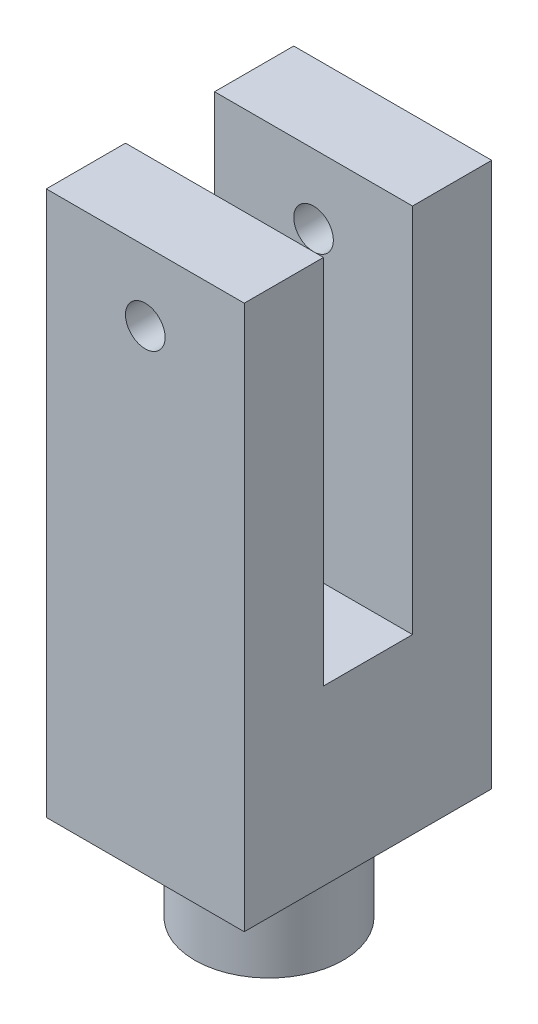
ISO-10303-21;
HEADER;
FILE_DESCRIPTION(('STEP AP214'),'2;1');
FILE_NAME('part.step','',(''),(''),'','','');
FILE_SCHEMA(('AUTOMOTIVE_DESIGN { 1 0 10303 214 1 1 1 1 }'));
ENDSEC;
DATA;
#1=APPLICATION_CONTEXT('core data for automotive mechanical design processes');
#2=APPLICATION_PROTOCOL_DEFINITION('international standard','automotive_design',2000,#1);
#3=PRODUCT_CONTEXT('',#1,'mechanical');
#4=PRODUCT('Part','Part','',(#3));
#5=PRODUCT_RELATED_PRODUCT_CATEGORY('part','',(#4));
#6=PRODUCT_DEFINITION_FORMATION('','',#4);
#7=PRODUCT_DEFINITION_CONTEXT('part definition',#1,'design');
#8=PRODUCT_DEFINITION('design','',#6,#7);
#9=PRODUCT_DEFINITION_SHAPE('','',#8);
#10=(LENGTH_UNIT() NAMED_UNIT(*) SI_UNIT(.MILLI.,.METRE.));
#11=(NAMED_UNIT(*) PLANE_ANGLE_UNIT() SI_UNIT($,.RADIAN.));
#12=(NAMED_UNIT(*) SI_UNIT($,.STERADIAN.) SOLID_ANGLE_UNIT());
#13=UNCERTAINTY_MEASURE_WITH_UNIT(LENGTH_MEASURE(1.E-05),#10,'distance_accuracy_value','');
#14=(GEOMETRIC_REPRESENTATION_CONTEXT(3) GLOBAL_UNCERTAINTY_ASSIGNED_CONTEXT((#13)) GLOBAL_UNIT_ASSIGNED_CONTEXT((#10,
#11,#12)) REPRESENTATION_CONTEXT('',''));
#15=CARTESIAN_POINT('',(0.,0.,0.));
#16=DIRECTION('',(0.,0.,1.));
#17=DIRECTION('',(1.,0.,0.));
#18=AXIS2_PLACEMENT_3D('',#15,#16,#17);
#19=CARTESIAN_POINT('',(0.,130.,0.));
#20=DIRECTION('',(0.,1.,0.));
#21=DIRECTION('',(0.,0.,1.));
#22=AXIS2_PLACEMENT_3D('',#19,#20,#21);
#23=PLANE('',#22);
#24=DIRECTION('',(-1.,0.,0.));
#25=VECTOR('',#24,1.);
#26=CARTESIAN_POINT('',(0.,130.,-9.));
#27=LINE('',#26,#25);
#28=CARTESIAN_POINT('',(20.,130.,-9.));
#29=VERTEX_POINT('',#28);
#30=CARTESIAN_POINT('',(-20.,130.,-8.99999999999999));
#31=VERTEX_POINT('',#30);
#32=EDGE_CURVE('E11',#29,#31,#27,.T.);
#33=ORIENTED_EDGE('',*,*,#32,.F.);
#34=DIRECTION('',(0.,0.,-1.));
#35=VECTOR('',#34,1.);
#36=CARTESIAN_POINT('',(20.,130.,-25.));
#37=LINE('',#36,#35);
#38=CARTESIAN_POINT('',(20.,130.,-25.));
#39=VERTEX_POINT('',#38);
#40=EDGE_CURVE('E87',#29,#39,#37,.T.);
#41=ORIENTED_EDGE('',*,*,#40,.T.);
#42=DIRECTION('',(-1.,0.,0.));
#43=VECTOR('',#42,1.);
#44=CARTESIAN_POINT('',(-20.,130.,-25.));
#45=LINE('',#44,#43);
#46=CARTESIAN_POINT('',(-20.,130.,-25.));
#47=VERTEX_POINT('',#46);
#48=EDGE_CURVE('E143',#39,#47,#45,.T.);
#49=ORIENTED_EDGE('',*,*,#48,.T.);
#50=DIRECTION('',(0.,0.,1.));
#51=VECTOR('',#50,1.);
#52=CARTESIAN_POINT('',(-20.,130.,-25.));
#53=LINE('',#52,#51);
#54=EDGE_CURVE('E145',#47,#31,#53,.T.);
#55=ORIENTED_EDGE('',*,*,#54,.T.);
#56=EDGE_LOOP('',(#33,#41,#49,#55));
#57=FACE_BOUND('',#56,.T.);
#58=ADVANCED_FACE('F33',(#57),#23,.T.);
#59=CARTESIAN_POINT('',(0.,20.,0.));
#60=DIRECTION('',(0.,-1.,0.));
#61=DIRECTION('',(0.,0.,-1.));
#62=AXIS2_PLACEMENT_3D('',#59,#60,#61);
#63=CYLINDRICAL_SURFACE('',#62,15.);
#64=CARTESIAN_POINT('',(0.,20.,0.));
#65=DIRECTION('',(0.,1.,0.));
#66=DIRECTION('',(0.,0.,1.));
#67=AXIS2_PLACEMENT_3D('',#64,#65,#66);
#68=CIRCLE('',#67,15.);
#69=CARTESIAN_POINT('',(0.,20.,15.));
#70=VERTEX_POINT('',#69);
#71=EDGE_CURVE('E167',#70,#70,#68,.T.);
#72=ORIENTED_EDGE('',*,*,#71,.F.);
#73=EDGE_LOOP('',(#72));
#74=FACE_BOUND('',#73,.T.);
#75=CARTESIAN_POINT('',(0.,0.,0.));
#76=DIRECTION('',(0.,1.,0.));
#77=DIRECTION('',(0.,0.,1.));
#78=AXIS2_PLACEMENT_3D('',#75,#76,#77);
#79=CIRCLE('',#78,15.);
#80=CARTESIAN_POINT('',(0.,0.,15.));
#81=VERTEX_POINT('',#80);
#82=EDGE_CURVE('E166',#81,#81,#79,.T.);
#83=ORIENTED_EDGE('',*,*,#82,.T.);
#84=EDGE_LOOP('',(#83));
#85=FACE_BOUND('',#84,.T.);
#86=ADVANCED_FACE('F35',(#74,#85),#63,.T.);
#87=CARTESIAN_POINT('',(0.,0.,0.));
#88=DIRECTION('',(0.,1.,0.));
#89=DIRECTION('',(0.,0.,1.));
#90=AXIS2_PLACEMENT_3D('',#87,#88,#89);
#91=PLANE('',#90);
#92=ORIENTED_EDGE('',*,*,#82,.F.);
#93=EDGE_LOOP('',(#92));
#94=FACE_BOUND('',#93,.T.);
#95=ADVANCED_FACE('F194',(#94),#91,.F.);
#96=CARTESIAN_POINT('',(0.,20.,0.));
#97=DIRECTION('',(0.,1.,0.));
#98=DIRECTION('',(0.,0.,1.));
#99=AXIS2_PLACEMENT_3D('',#96,#97,#98);
#100=PLANE('',#99);
#101=DIRECTION('',(0.,0.,-1.));
#102=VECTOR('',#101,1.);
#103=CARTESIAN_POINT('',(20.,20.,-25.));
#104=LINE('',#103,#102);
#105=CARTESIAN_POINT('',(20.,20.,25.));
#106=VERTEX_POINT('',#105);
#107=CARTESIAN_POINT('',(20.,20.,-25.));
#108=VERTEX_POINT('',#107);
#109=EDGE_CURVE('E139',#106,#108,#104,.T.);
#110=ORIENTED_EDGE('',*,*,#109,.F.);
#111=DIRECTION('',(1.,0.,0.));
#112=VECTOR('',#111,1.);
#113=CARTESIAN_POINT('',(-20.,20.,25.));
#114=LINE('',#113,#112);
#115=CARTESIAN_POINT('',(-20.,20.,25.));
#116=VERTEX_POINT('',#115);
#117=EDGE_CURVE('E79',#116,#106,#114,.T.);
#118=ORIENTED_EDGE('',*,*,#117,.F.);
#119=DIRECTION('',(0.,0.,1.));
#120=VECTOR('',#119,1.);
#121=CARTESIAN_POINT('',(-20.,20.,-25.));
#122=LINE('',#121,#120);
#123=CARTESIAN_POINT('',(-20.,20.,-25.));
#124=VERTEX_POINT('',#123);
#125=EDGE_CURVE('E154',#124,#116,#122,.T.);
#126=ORIENTED_EDGE('',*,*,#125,.F.);
#127=DIRECTION('',(-1.,0.,0.));
#128=VECTOR('',#127,1.);
#129=CARTESIAN_POINT('',(-20.,20.,-25.));
#130=LINE('',#129,#128);
#131=EDGE_CURVE('E152',#108,#124,#130,.T.);
#132=ORIENTED_EDGE('',*,*,#131,.F.);
#133=EDGE_LOOP('',(#110,#118,#126,#132));
#134=FACE_BOUND('',#133,.T.);
#135=ORIENTED_EDGE('',*,*,#71,.T.);
#136=EDGE_LOOP('',(#135));
#137=FACE_BOUND('',#136,.T.);
#138=ADVANCED_FACE('F205',(#134,#137),#100,.F.);
#139=CARTESIAN_POINT('',(20.,130.,-25.));
#140=DIRECTION('',(-1.,0.,0.));
#141=DIRECTION('',(0.,0.,1.));
#142=AXIS2_PLACEMENT_3D('',#139,#140,#141);
#143=PLANE('',#142);
#144=ORIENTED_EDGE('',*,*,#40,.F.);
#145=DIRECTION('',(0.,1.,0.));
#146=VECTOR('',#145,1.);
#147=CARTESIAN_POINT('',(20.,205.,-8.99999999999999));
#148=LINE('',#147,#146);
#149=CARTESIAN_POINT('',(20.,55.,-9.00000000000001));
#150=VERTEX_POINT('',#149);
#151=EDGE_CURVE('E134',#150,#29,#148,.T.);
#152=ORIENTED_EDGE('',*,*,#151,.F.);
#153=DIRECTION('',(0.,0.,-1.));
#154=VECTOR('',#153,1.);
#155=CARTESIAN_POINT('',(20.,55.,8.99999999999999));
#156=LINE('',#155,#154);
#157=CARTESIAN_POINT('',(20.,55.,8.99999999999999));
#158=VERTEX_POINT('',#157);
#159=EDGE_CURVE('E130',#158,#150,#156,.T.);
#160=ORIENTED_EDGE('',*,*,#159,.F.);
#161=DIRECTION('',(0.,-1.,0.));
#162=VECTOR('',#161,1.);
#163=CARTESIAN_POINT('',(20.,205.,9.00000000000001));
#164=LINE('',#163,#162);
#165=CARTESIAN_POINT('',(20.,130.,9.));
#166=VERTEX_POINT('',#165);
#167=EDGE_CURVE('E111',#166,#158,#164,.T.);
#168=ORIENTED_EDGE('',*,*,#167,.F.);
#169=CARTESIAN_POINT('',(20.,130.,25.));
#170=VERTEX_POINT('',#169);
#171=EDGE_CURVE('E141',#170,#166,#37,.T.);
#172=ORIENTED_EDGE('',*,*,#171,.F.);
#173=DIRECTION('',(0.,-1.,0.));
#174=VECTOR('',#173,1.);
#175=CARTESIAN_POINT('',(20.,130.,25.));
#176=LINE('',#175,#174);
#177=EDGE_CURVE('E149',#170,#106,#176,.T.);
#178=ORIENTED_EDGE('',*,*,#177,.T.);
#179=ORIENTED_EDGE('',*,*,#109,.T.);
#180=DIRECTION('',(0.,-1.,0.));
#181=VECTOR('',#180,1.);
#182=CARTESIAN_POINT('',(20.,130.,-25.));
#183=LINE('',#182,#181);
#184=EDGE_CURVE('E163',#39,#108,#183,.T.);
#185=ORIENTED_EDGE('',*,*,#184,.F.);
#186=EDGE_LOOP('',(#144,#152,#160,#168,#172,#178,#179,#185));
#187=FACE_BOUND('',#186,.T.);
#188=ADVANCED_FACE('F174',(#187),#143,.F.);
#189=CARTESIAN_POINT('',(-20.,130.,-25.));
#190=DIRECTION('',(0.,0.,1.));
#191=DIRECTION('',(1.,0.,0.));
#192=AXIS2_PLACEMENT_3D('',#189,#190,#191);
#193=PLANE('',#192);
#194=CARTESIAN_POINT('',(0.,116.,-25.));
#195=DIRECTION('',(0.,0.,-1.));
#196=DIRECTION('',(-1.,0.,0.));
#197=AXIS2_PLACEMENT_3D('',#194,#195,#196);
#198=CIRCLE('',#197,4.);
#199=CARTESIAN_POINT('',(-4.00000000000001,116.,-25.));
#200=VERTEX_POINT('',#199);
#201=EDGE_CURVE('E315',#200,#200,#198,.T.);
#202=ORIENTED_EDGE('',*,*,#201,.F.);
#203=EDGE_LOOP('',(#202));
#204=FACE_BOUND('',#203,.T.);
#205=ORIENTED_EDGE('',*,*,#131,.T.);
#206=DIRECTION('',(0.,-1.,0.));
#207=VECTOR('',#206,1.);
#208=CARTESIAN_POINT('',(-20.,130.,-25.));
#209=LINE('',#208,#207);
#210=EDGE_CURVE('E160',#47,#124,#209,.T.);
#211=ORIENTED_EDGE('',*,*,#210,.F.);
#212=ORIENTED_EDGE('',*,*,#48,.F.);
#213=ORIENTED_EDGE('',*,*,#184,.T.);
#214=EDGE_LOOP('',(#205,#211,#212,#213));
#215=FACE_BOUND('',#214,.T.);
#216=ADVANCED_FACE('F201',(#204,#215),#193,.F.);
#217=CARTESIAN_POINT('',(-20.,130.,-25.));
#218=DIRECTION('',(1.,0.,0.));
#219=DIRECTION('',(0.,0.,-1.));
#220=AXIS2_PLACEMENT_3D('',#217,#218,#219);
#221=PLANE('',#220);
#222=DIRECTION('',(0.,0.,-1.));
#223=VECTOR('',#222,1.);
#224=CARTESIAN_POINT('',(-20.,55.,9.));
#225=LINE('',#224,#223);
#226=CARTESIAN_POINT('',(-20.,55.,9.));
#227=VERTEX_POINT('',#226);
#228=CARTESIAN_POINT('',(-20.,55.,-9.));
#229=VERTEX_POINT('',#228);
#230=EDGE_CURVE('E116',#227,#229,#225,.T.);
#231=ORIENTED_EDGE('',*,*,#230,.T.);
#232=DIRECTION('',(0.,1.,0.));
#233=VECTOR('',#232,1.);
#234=CARTESIAN_POINT('',(-20.,205.,-8.99999999999998));
#235=LINE('',#234,#233);
#236=EDGE_CURVE('E128',#229,#31,#235,.T.);
#237=ORIENTED_EDGE('',*,*,#236,.T.);
#238=ORIENTED_EDGE('',*,*,#54,.F.);
#239=ORIENTED_EDGE('',*,*,#210,.T.);
#240=ORIENTED_EDGE('',*,*,#125,.T.);
#241=DIRECTION('',(0.,-1.,0.));
#242=VECTOR('',#241,1.);
#243=CARTESIAN_POINT('',(-20.,130.,25.));
#244=LINE('',#243,#242);
#245=CARTESIAN_POINT('',(-20.,130.,25.));
#246=VERTEX_POINT('',#245);
#247=EDGE_CURVE('E158',#246,#116,#244,.T.);
#248=ORIENTED_EDGE('',*,*,#247,.F.);
#249=CARTESIAN_POINT('',(-20.,130.,9.00000000000001));
#250=VERTEX_POINT('',#249);
#251=EDGE_CURVE('E127',#250,#246,#53,.T.);
#252=ORIENTED_EDGE('',*,*,#251,.F.);
#253=DIRECTION('',(0.,-1.,0.));
#254=VECTOR('',#253,1.);
#255=CARTESIAN_POINT('',(-20.,205.,9.00000000000001));
#256=LINE('',#255,#254);
#257=EDGE_CURVE('E49',#250,#227,#256,.T.);
#258=ORIENTED_EDGE('',*,*,#257,.T.);
#259=EDGE_LOOP('',(#231,#237,#238,#239,#240,#248,#252,#258));
#260=FACE_BOUND('',#259,.T.);
#261=ADVANCED_FACE('F125',(#260),#221,.F.);
#262=CARTESIAN_POINT('',(-20.,130.,25.));
#263=DIRECTION('',(0.,0.,-1.));
#264=DIRECTION('',(-1.,0.,0.));
#265=AXIS2_PLACEMENT_3D('',#262,#263,#264);
#266=PLANE('',#265);
#267=CARTESIAN_POINT('',(0.,116.,25.));
#268=DIRECTION('',(0.,0.,-1.));
#269=DIRECTION('',(-1.,0.,0.));
#270=AXIS2_PLACEMENT_3D('',#267,#268,#269);
#271=CIRCLE('',#270,4.);
#272=CARTESIAN_POINT('',(-4.00000000000001,116.,25.));
#273=VERTEX_POINT('',#272);
#274=EDGE_CURVE('E319',#273,#273,#271,.T.);
#275=ORIENTED_EDGE('',*,*,#274,.T.);
#276=EDGE_LOOP('',(#275));
#277=FACE_BOUND('',#276,.T.);
#278=ORIENTED_EDGE('',*,*,#117,.T.);
#279=ORIENTED_EDGE('',*,*,#177,.F.);
#280=DIRECTION('',(1.,0.,0.));
#281=VECTOR('',#280,1.);
#282=CARTESIAN_POINT('',(-20.,130.,25.));
#283=LINE('',#282,#281);
#284=EDGE_CURVE('E58',#246,#170,#283,.T.);
#285=ORIENTED_EDGE('',*,*,#284,.F.);
#286=ORIENTED_EDGE('',*,*,#247,.T.);
#287=EDGE_LOOP('',(#278,#279,#285,#286));
#288=FACE_BOUND('',#287,.T.);
#289=ADVANCED_FACE('F179',(#277,#288),#266,.F.);
#290=DIRECTION('',(1.,0.,0.));
#291=VECTOR('',#290,1.);
#292=CARTESIAN_POINT('',(0.,130.,9.));
#293=LINE('',#292,#291);
#294=EDGE_CURVE('E42',#250,#166,#293,.T.);
#295=ORIENTED_EDGE('',*,*,#294,.F.);
#296=ORIENTED_EDGE('',*,*,#251,.T.);
#297=ORIENTED_EDGE('',*,*,#284,.T.);
#298=ORIENTED_EDGE('',*,*,#171,.T.);
#299=EDGE_LOOP('',(#295,#296,#297,#298));
#300=FACE_BOUND('',#299,.T.);
#301=ADVANCED_FACE('F176',(#300),#23,.T.);
#302=CARTESIAN_POINT('',(-20.,205.,-8.99999999999998));
#303=DIRECTION('',(0.,0.,-1.));
#304=DIRECTION('',(-1.,0.,0.));
#305=AXIS2_PLACEMENT_3D('',#302,#303,#304);
#306=PLANE('',#305);
#307=CARTESIAN_POINT('',(0.,116.,-9.));
#308=DIRECTION('',(0.,0.,-1.));
#309=DIRECTION('',(-1.,0.,0.));
#310=AXIS2_PLACEMENT_3D('',#307,#308,#309);
#311=CIRCLE('',#310,4.);
#312=CARTESIAN_POINT('',(-4.00000000000001,116.,-9.));
#313=VERTEX_POINT('',#312);
#314=EDGE_CURVE('E136',#313,#313,#311,.T.);
#315=ORIENTED_EDGE('',*,*,#314,.T.);
#316=EDGE_LOOP('',(#315));
#317=FACE_BOUND('',#316,.T.);
#318=ORIENTED_EDGE('',*,*,#32,.T.);
#319=ORIENTED_EDGE('',*,*,#236,.F.);
#320=DIRECTION('',(1.,0.,0.));
#321=VECTOR('',#320,1.);
#322=CARTESIAN_POINT('',(-20.,55.,-9.));
#323=LINE('',#322,#321);
#324=EDGE_CURVE('E115',#229,#150,#323,.T.);
#325=ORIENTED_EDGE('',*,*,#324,.T.);
#326=ORIENTED_EDGE('',*,*,#151,.T.);
#327=EDGE_LOOP('',(#318,#319,#325,#326));
#328=FACE_BOUND('',#327,.T.);
#329=ADVANCED_FACE('F178',(#317,#328),#306,.F.);
#330=CARTESIAN_POINT('',(-20.,55.,9.));
#331=DIRECTION('',(0.,-1.,0.));
#332=DIRECTION('',(0.,0.,-1.));
#333=AXIS2_PLACEMENT_3D('',#330,#331,#332);
#334=PLANE('',#333);
#335=ORIENTED_EDGE('',*,*,#159,.T.);
#336=ORIENTED_EDGE('',*,*,#324,.F.);
#337=ORIENTED_EDGE('',*,*,#230,.F.);
#338=DIRECTION('',(1.,0.,0.));
#339=VECTOR('',#338,1.);
#340=CARTESIAN_POINT('',(-20.,55.,9.));
#341=LINE('',#340,#339);
#342=EDGE_CURVE('E107',#227,#158,#341,.T.);
#343=ORIENTED_EDGE('',*,*,#342,.T.);
#344=EDGE_LOOP('',(#335,#336,#337,#343));
#345=FACE_BOUND('',#344,.T.);
#346=ADVANCED_FACE('F119',(#345),#334,.F.);
#347=CARTESIAN_POINT('',(-20.,205.,9.00000000000001));
#348=DIRECTION('',(0.,0.,1.));
#349=DIRECTION('',(1.,0.,0.));
#350=AXIS2_PLACEMENT_3D('',#347,#348,#349);
#351=PLANE('',#350);
#352=CARTESIAN_POINT('',(0.,116.,9.));
#353=DIRECTION('',(0.,0.,1.));
#354=DIRECTION('',(1.,0.,0.));
#355=AXIS2_PLACEMENT_3D('',#352,#353,#354);
#356=CIRCLE('',#355,4.);
#357=CARTESIAN_POINT('',(4.,116.,9.));
#358=VERTEX_POINT('',#357);
#359=EDGE_CURVE('E37',#358,#358,#356,.T.);
#360=ORIENTED_EDGE('',*,*,#359,.T.);
#361=EDGE_LOOP('',(#360));
#362=FACE_BOUND('',#361,.T.);
#363=ORIENTED_EDGE('',*,*,#294,.T.);
#364=ORIENTED_EDGE('',*,*,#167,.T.);
#365=ORIENTED_EDGE('',*,*,#342,.F.);
#366=ORIENTED_EDGE('',*,*,#257,.F.);
#367=EDGE_LOOP('',(#363,#364,#365,#366));
#368=FACE_BOUND('',#367,.T.);
#369=ADVANCED_FACE('F109',(#362,#368),#351,.F.);
#370=CARTESIAN_POINT('',(0.,116.,25.));
#371=DIRECTION('',(0.,0.,-1.));
#372=DIRECTION('',(-1.,0.,0.));
#373=AXIS2_PLACEMENT_3D('',#370,#371,#372);
#374=CYLINDRICAL_SURFACE('',#373,4.);
#375=ORIENTED_EDGE('',*,*,#274,.F.);
#376=EDGE_LOOP('',(#375));
#377=FACE_BOUND('',#376,.T.);
#378=ORIENTED_EDGE('',*,*,#359,.F.);
#379=EDGE_LOOP('',(#378));
#380=FACE_BOUND('',#379,.T.);
#381=ADVANCED_FACE('F253',(#377,#380),#374,.F.);
#382=ORIENTED_EDGE('',*,*,#201,.T.);
#383=EDGE_LOOP('',(#382));
#384=FACE_BOUND('',#383,.T.);
#385=ORIENTED_EDGE('',*,*,#314,.F.);
#386=EDGE_LOOP('',(#385));
#387=FACE_BOUND('',#386,.T.);
#388=ADVANCED_FACE('F263',(#384,#387),#374,.F.);
#389=CLOSED_SHELL('',(#58,#86,#95,#138,#188,#216,#261,#289,#301,#329,#346,#369,#381,#388));
#390=MANIFOLD_SOLID_BREP('B2',#389);
#391=ADVANCED_BREP_SHAPE_REPRESENTATION('',(#18,#390),#14);
#392=SHAPE_DEFINITION_REPRESENTATION(#9,#391);
ENDSEC;
END-ISO-10303-21;
